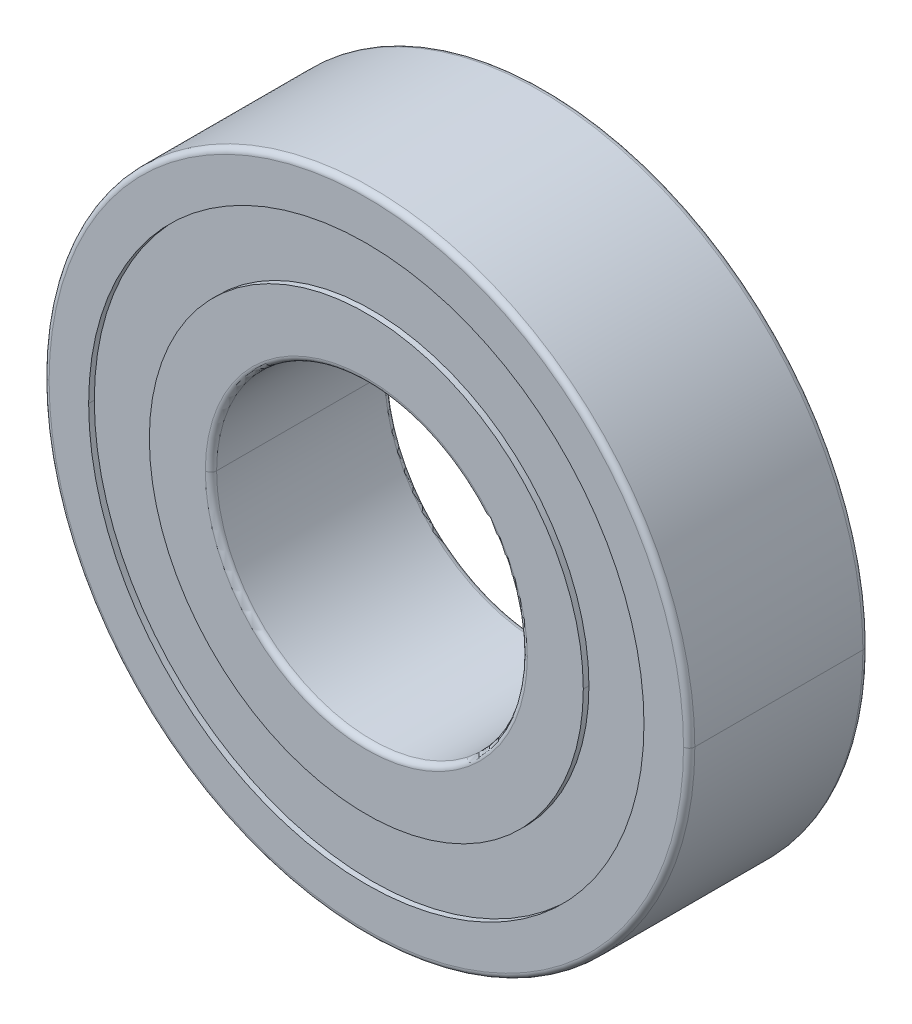
ISO-10303-21;
HEADER;
FILE_DESCRIPTION(('STEP AP214'),'2;1');
FILE_NAME('part.step','',(''),(''),'','','');
FILE_SCHEMA(('AUTOMOTIVE_DESIGN { 1 0 10303 214 1 1 1 1 }'));
ENDSEC;
DATA;
#1=APPLICATION_CONTEXT('core data for automotive mechanical design processes');
#2=APPLICATION_PROTOCOL_DEFINITION('international standard','automotive_design',2000,#1);
#3=PRODUCT_CONTEXT('',#1,'mechanical');
#4=PRODUCT('Part','Part','',(#3));
#5=PRODUCT_RELATED_PRODUCT_CATEGORY('part','',(#4));
#6=PRODUCT_DEFINITION_FORMATION('','',#4);
#7=PRODUCT_DEFINITION_CONTEXT('part definition',#1,'design');
#8=PRODUCT_DEFINITION('design','',#6,#7);
#9=PRODUCT_DEFINITION_SHAPE('','',#8);
#10=(LENGTH_UNIT() NAMED_UNIT(*) SI_UNIT(.MILLI.,.METRE.));
#11=(NAMED_UNIT(*) PLANE_ANGLE_UNIT() SI_UNIT($,.RADIAN.));
#12=(NAMED_UNIT(*) SI_UNIT($,.STERADIAN.) SOLID_ANGLE_UNIT());
#13=UNCERTAINTY_MEASURE_WITH_UNIT(LENGTH_MEASURE(1.E-05),#10,'distance_accuracy_value','');
#14=(GEOMETRIC_REPRESENTATION_CONTEXT(3) GLOBAL_UNCERTAINTY_ASSIGNED_CONTEXT((#13)) GLOBAL_UNIT_ASSIGNED_CONTEXT((#10,
#11,#12)) REPRESENTATION_CONTEXT('',''));
#15=CARTESIAN_POINT('',(0.,0.,0.));
#16=DIRECTION('',(0.,0.,1.));
#17=DIRECTION('',(1.,0.,0.));
#18=AXIS2_PLACEMENT_3D('',#15,#16,#17);
#19=CARTESIAN_POINT('',(0.,0.,-3.71875));
#20=DIRECTION('',(0.,0.,1.));
#21=DIRECTION('',(1.,0.,0.));
#22=AXIS2_PLACEMENT_3D('',#19,#20,#21);
#23=TOROIDAL_SURFACE('',#22,14.0375,0.25);
#24=CARTESIAN_POINT('',(-14.0375,0.,-3.71875));
#25=DIRECTION('',(0.,1.,0.));
#26=DIRECTION('',(-1.,0.,0.));
#27=AXIS2_PLACEMENT_3D('',#24,#25,#26);
#28=CIRCLE('',#27,0.25);
#29=CARTESIAN_POINT('',(-14.0375,0.,-3.96875));
#30=VERTEX_POINT('',#29);
#31=CARTESIAN_POINT('',(-14.2875,0.,-3.71875));
#32=VERTEX_POINT('',#31);
#33=EDGE_CURVE('E305',#30,#32,#28,.T.);
#34=ORIENTED_EDGE('',*,*,#33,.F.);
#35=CARTESIAN_POINT('',(0.,0.,-3.96875));
#36=DIRECTION('',(0.,0.,-1.));
#37=DIRECTION('',(1.,0.,0.));
#38=AXIS2_PLACEMENT_3D('',#35,#36,#37);
#39=CIRCLE('',#38,14.0375);
#40=CARTESIAN_POINT('',(14.0375,0.,-3.96875));
#41=VERTEX_POINT('',#40);
#42=EDGE_CURVE('E355',#41,#30,#39,.T.);
#43=ORIENTED_EDGE('',*,*,#42,.F.);
#44=CARTESIAN_POINT('',(14.0375,0.,-3.71875));
#45=DIRECTION('',(0.,-1.,0.));
#46=DIRECTION('',(0.,0.,-1.));
#47=AXIS2_PLACEMENT_3D('',#44,#45,#46);
#48=CIRCLE('',#47,0.25);
#49=CARTESIAN_POINT('',(14.2875,0.,-3.71875));
#50=VERTEX_POINT('',#49);
#51=EDGE_CURVE('E208',#41,#50,#48,.T.);
#52=ORIENTED_EDGE('',*,*,#51,.T.);
#53=CARTESIAN_POINT('',(0.,0.,-3.71875));
#54=DIRECTION('',(0.,0.,1.));
#55=DIRECTION('',(1.,0.,0.));
#56=AXIS2_PLACEMENT_3D('',#53,#54,#55);
#57=CIRCLE('',#56,14.2875);
#58=EDGE_CURVE('E351',#32,#50,#57,.T.);
#59=ORIENTED_EDGE('',*,*,#58,.F.);
#60=EDGE_LOOP('',(#34,#43,#52,#59));
#61=FACE_BOUND('',#60,.T.);
#62=ADVANCED_FACE('F15',(#61),#23,.T.);
#63=CARTESIAN_POINT('',(0.,0.,3.71875));
#64=DIRECTION('',(0.,0.,-1.));
#65=DIRECTION('',(-1.,0.,0.));
#66=AXIS2_PLACEMENT_3D('',#63,#64,#65);
#67=TOROIDAL_SURFACE('',#66,7.125,0.25);
#68=CARTESIAN_POINT('',(7.125,0.,3.71875));
#69=DIRECTION('',(0.,1.,0.));
#70=DIRECTION('',(-1.,0.,0.));
#71=AXIS2_PLACEMENT_3D('',#68,#69,#70);
#72=CIRCLE('',#71,0.25);
#73=CARTESIAN_POINT('',(6.875,0.,3.71875));
#74=VERTEX_POINT('',#73);
#75=CARTESIAN_POINT('',(7.125,0.,3.96875));
#76=VERTEX_POINT('',#75);
#77=EDGE_CURVE('E186',#74,#76,#72,.T.);
#78=ORIENTED_EDGE('',*,*,#77,.F.);
#79=CARTESIAN_POINT('',(0.,0.,3.71875));
#80=DIRECTION('',(0.,0.,1.));
#81=DIRECTION('',(-1.,0.,0.));
#82=AXIS2_PLACEMENT_3D('',#79,#80,#81);
#83=CIRCLE('',#82,6.875);
#84=CARTESIAN_POINT('',(-6.875,0.,3.71875));
#85=VERTEX_POINT('',#84);
#86=EDGE_CURVE('E179',#85,#74,#83,.T.);
#87=ORIENTED_EDGE('',*,*,#86,.F.);
#88=CARTESIAN_POINT('',(-7.125,0.,3.71875));
#89=DIRECTION('',(0.,-1.,0.));
#90=DIRECTION('',(0.,0.,-1.));
#91=AXIS2_PLACEMENT_3D('',#88,#89,#90);
#92=CIRCLE('',#91,0.25);
#93=CARTESIAN_POINT('',(-7.125,0.,3.96875));
#94=VERTEX_POINT('',#93);
#95=EDGE_CURVE('E183',#85,#94,#92,.T.);
#96=ORIENTED_EDGE('',*,*,#95,.T.);
#97=CARTESIAN_POINT('',(0.,0.,3.96875));
#98=DIRECTION('',(0.,0.,-1.));
#99=DIRECTION('',(-1.,0.,0.));
#100=AXIS2_PLACEMENT_3D('',#97,#98,#99);
#101=CIRCLE('',#100,7.125);
#102=EDGE_CURVE('E10',#76,#94,#101,.T.);
#103=ORIENTED_EDGE('',*,*,#102,.F.);
#104=EDGE_LOOP('',(#78,#87,#96,#103));
#105=FACE_BOUND('',#104,.T.);
#106=ADVANCED_FACE('F181',(#105),#67,.T.);
#107=CARTESIAN_POINT('',(0.,0.,-3.71875));
#108=DIRECTION('',(0.,0.,1.));
#109=DIRECTION('',(1.,0.,0.));
#110=AXIS2_PLACEMENT_3D('',#107,#108,#109);
#111=TOROIDAL_SURFACE('',#110,7.125,0.25);
#112=CARTESIAN_POINT('',(-7.125,0.,-3.71875));
#113=DIRECTION('',(0.,1.,0.));
#114=DIRECTION('',(-1.,0.,0.));
#115=AXIS2_PLACEMENT_3D('',#112,#113,#114);
#116=CIRCLE('',#115,0.25);
#117=CARTESIAN_POINT('',(-6.875,0.,-3.71875));
#118=VERTEX_POINT('',#117);
#119=CARTESIAN_POINT('',(-7.125,0.,-3.96875));
#120=VERTEX_POINT('',#119);
#121=EDGE_CURVE('E246',#118,#120,#116,.T.);
#122=ORIENTED_EDGE('',*,*,#121,.F.);
#123=CARTESIAN_POINT('',(0.,0.,-3.71875));
#124=DIRECTION('',(0.,0.,-1.));
#125=DIRECTION('',(1.,0.,0.));
#126=AXIS2_PLACEMENT_3D('',#123,#124,#125);
#127=CIRCLE('',#126,6.875);
#128=CARTESIAN_POINT('',(6.875,0.,-3.71875));
#129=VERTEX_POINT('',#128);
#130=EDGE_CURVE('E195',#129,#118,#127,.T.);
#131=ORIENTED_EDGE('',*,*,#130,.F.);
#132=CARTESIAN_POINT('',(7.125,0.,-3.71875));
#133=DIRECTION('',(0.,-1.,0.));
#134=DIRECTION('',(0.,0.,-1.));
#135=AXIS2_PLACEMENT_3D('',#132,#133,#134);
#136=CIRCLE('',#135,0.25);
#137=CARTESIAN_POINT('',(7.125,0.,-3.96875));
#138=VERTEX_POINT('',#137);
#139=EDGE_CURVE('E225',#129,#138,#136,.T.);
#140=ORIENTED_EDGE('',*,*,#139,.T.);
#141=CARTESIAN_POINT('',(0.,0.,-3.96875));
#142=DIRECTION('',(0.,0.,1.));
#143=DIRECTION('',(1.,0.,0.));
#144=AXIS2_PLACEMENT_3D('',#141,#142,#143);
#145=CIRCLE('',#144,7.125);
#146=EDGE_CURVE('E262',#120,#138,#145,.T.);
#147=ORIENTED_EDGE('',*,*,#146,.F.);
#148=EDGE_LOOP('',(#122,#131,#140,#147));
#149=FACE_BOUND('',#148,.T.);
#150=ADVANCED_FACE('F418',(#149),#111,.T.);
#151=CARTESIAN_POINT('',(0.,0.,3.71875));
#152=DIRECTION('',(0.,0.,-1.));
#153=DIRECTION('',(-1.,0.,0.));
#154=AXIS2_PLACEMENT_3D('',#151,#152,#153);
#155=TOROIDAL_SURFACE('',#154,14.0375,0.25);
#156=CARTESIAN_POINT('',(14.0375,0.,3.71875));
#157=DIRECTION('',(0.,1.,0.));
#158=DIRECTION('',(-1.,0.,0.));
#159=AXIS2_PLACEMENT_3D('',#156,#157,#158);
#160=CIRCLE('',#159,0.25);
#161=CARTESIAN_POINT('',(14.0375,0.,3.96875));
#162=VERTEX_POINT('',#161);
#163=CARTESIAN_POINT('',(14.2875,0.,3.71875));
#164=VERTEX_POINT('',#163);
#165=EDGE_CURVE('E224',#162,#164,#160,.T.);
#166=ORIENTED_EDGE('',*,*,#165,.F.);
#167=CARTESIAN_POINT('',(0.,0.,3.96875));
#168=DIRECTION('',(0.,0.,1.));
#169=DIRECTION('',(-1.,0.,0.));
#170=AXIS2_PLACEMENT_3D('',#167,#168,#169);
#171=CIRCLE('',#170,14.0375);
#172=CARTESIAN_POINT('',(-14.0375,0.,3.96875));
#173=VERTEX_POINT('',#172);
#174=EDGE_CURVE('E263',#173,#162,#171,.T.);
#175=ORIENTED_EDGE('',*,*,#174,.F.);
#176=CARTESIAN_POINT('',(-14.0375,0.,3.71875));
#177=DIRECTION('',(0.,-1.,0.));
#178=DIRECTION('',(0.,0.,-1.));
#179=AXIS2_PLACEMENT_3D('',#176,#177,#178);
#180=CIRCLE('',#179,0.25);
#181=CARTESIAN_POINT('',(-14.2875,0.,3.71875));
#182=VERTEX_POINT('',#181);
#183=EDGE_CURVE('E228',#173,#182,#180,.T.);
#184=ORIENTED_EDGE('',*,*,#183,.T.);
#185=CARTESIAN_POINT('',(0.,0.,3.71875));
#186=DIRECTION('',(0.,0.,-1.));
#187=DIRECTION('',(-1.,0.,0.));
#188=AXIS2_PLACEMENT_3D('',#185,#186,#187);
#189=CIRCLE('',#188,14.2875);
#190=EDGE_CURVE('E268',#164,#182,#189,.T.);
#191=ORIENTED_EDGE('',*,*,#190,.F.);
#192=EDGE_LOOP('',(#166,#175,#184,#191));
#193=FACE_BOUND('',#192,.T.);
#194=ADVANCED_FACE('F393',(#193),#155,.T.);
#195=CARTESIAN_POINT('',(0.,0.,53.2489151398072));
#196=DIRECTION('',(0.,0.,1.));
#197=DIRECTION('',(1.,0.,0.));
#198=AXIS2_PLACEMENT_3D('',#195,#196,#197);
#199=CYLINDRICAL_SURFACE('',#198,6.875);
#200=DIRECTION('',(0.,0.,1.));
#201=VECTOR('',#200,1.);
#202=CARTESIAN_POINT('',(-6.875,0.,53.2489151398072));
#203=LINE('',#202,#201);
#204=EDGE_CURVE('E190',#118,#85,#203,.T.);
#205=ORIENTED_EDGE('',*,*,#204,.F.);
#206=CARTESIAN_POINT('',(0.,0.,-3.71875));
#207=DIRECTION('',(0.,0.,-1.));
#208=DIRECTION('',(1.,0.,0.));
#209=AXIS2_PLACEMENT_3D('',#206,#207,#208);
#210=CIRCLE('',#209,6.875);
#211=EDGE_CURVE('E205',#118,#129,#210,.T.);
#212=ORIENTED_EDGE('',*,*,#211,.T.);
#213=DIRECTION('',(0.,0.,1.));
#214=VECTOR('',#213,1.);
#215=CARTESIAN_POINT('',(6.875,0.,53.2489151398072));
#216=LINE('',#215,#214);
#217=EDGE_CURVE('E19',#129,#74,#216,.T.);
#218=ORIENTED_EDGE('',*,*,#217,.T.);
#219=CARTESIAN_POINT('',(0.,0.,3.71875));
#220=DIRECTION('',(0.,0.,1.));
#221=DIRECTION('',(-1.,0.,0.));
#222=AXIS2_PLACEMENT_3D('',#219,#220,#221);
#223=CIRCLE('',#222,6.875);
#224=EDGE_CURVE('E201',#74,#85,#223,.T.);
#225=ORIENTED_EDGE('',*,*,#224,.T.);
#226=EDGE_LOOP('',(#205,#212,#218,#225));
#227=FACE_BOUND('',#226,.T.);
#228=ADVANCED_FACE('F17',(#227),#199,.F.);
#229=CARTESIAN_POINT('',(0.,9.602,3.96875));
#230=DIRECTION('',(0.,0.,-1.));
#231=DIRECTION('',(0.,-1.,0.));
#232=AXIS2_PLACEMENT_3D('',#229,#230,#231);
#233=PLANE('',#232);
#234=CARTESIAN_POINT('',(0.,0.,3.96875));
#235=DIRECTION('',(0.,0.,-1.));
#236=DIRECTION('',(-1.,0.,0.));
#237=AXIS2_PLACEMENT_3D('',#234,#235,#236);
#238=CIRCLE('',#237,7.125);
#239=EDGE_CURVE('E203',#94,#76,#238,.T.);
#240=ORIENTED_EDGE('',*,*,#239,.T.);
#241=ORIENTED_EDGE('',*,*,#102,.T.);
#242=EDGE_LOOP('',(#240,#241));
#243=FACE_BOUND('',#242,.T.);
#244=CARTESIAN_POINT('',(0.,0.,3.96875));
#245=DIRECTION('',(0.,0.,1.));
#246=DIRECTION('',(1.,0.,0.));
#247=AXIS2_PLACEMENT_3D('',#244,#245,#246);
#248=CIRCLE('',#247,9.602);
#249=CARTESIAN_POINT('',(9.602,0.,3.96875));
#250=VERTEX_POINT('',#249);
#251=CARTESIAN_POINT('',(-9.602,0.,3.96875));
#252=VERTEX_POINT('',#251);
#253=EDGE_CURVE('E269',#250,#252,#248,.T.);
#254=ORIENTED_EDGE('',*,*,#253,.T.);
#255=CARTESIAN_POINT('',(0.,0.,3.96875));
#256=DIRECTION('',(0.,0.,1.));
#257=DIRECTION('',(1.,0.,0.));
#258=AXIS2_PLACEMENT_3D('',#255,#256,#257);
#259=CIRCLE('',#258,9.602);
#260=EDGE_CURVE('E26',#252,#250,#259,.T.);
#261=ORIENTED_EDGE('',*,*,#260,.T.);
#262=EDGE_LOOP('',(#254,#261));
#263=FACE_BOUND('',#262,.T.);
#264=ADVANCED_FACE('F421',(#243,#263),#233,.F.);
#265=CARTESIAN_POINT('',(0.,0.,53.2489151398072));
#266=DIRECTION('',(0.,0.,1.));
#267=DIRECTION('',(1.,0.,0.));
#268=AXIS2_PLACEMENT_3D('',#265,#266,#267);
#269=CYLINDRICAL_SURFACE('',#268,9.602);
#270=DIRECTION('',(0.,0.,1.));
#271=VECTOR('',#270,1.);
#272=CARTESIAN_POINT('',(-9.602,0.,53.2489151398072));
#273=LINE('',#272,#271);
#274=CARTESIAN_POINT('',(-9.602,0.,3.71875));
#275=VERTEX_POINT('',#274);
#276=EDGE_CURVE('E274',#275,#252,#273,.T.);
#277=ORIENTED_EDGE('',*,*,#276,.F.);
#278=CARTESIAN_POINT('',(0.,0.,3.71875));
#279=DIRECTION('',(0.,0.,1.));
#280=DIRECTION('',(1.,0.,0.));
#281=AXIS2_PLACEMENT_3D('',#278,#279,#280);
#282=CIRCLE('',#281,9.602);
#283=CARTESIAN_POINT('',(9.602,0.,3.71875));
#284=VERTEX_POINT('',#283);
#285=EDGE_CURVE('E297',#275,#284,#282,.T.);
#286=ORIENTED_EDGE('',*,*,#285,.T.);
#287=DIRECTION('',(0.,0.,1.));
#288=VECTOR('',#287,1.);
#289=CARTESIAN_POINT('',(9.602,0.,53.2489151398072));
#290=LINE('',#289,#288);
#291=EDGE_CURVE('E273',#284,#250,#290,.T.);
#292=ORIENTED_EDGE('',*,*,#291,.T.);
#293=ORIENTED_EDGE('',*,*,#260,.F.);
#294=EDGE_LOOP('',(#277,#286,#292,#293));
#295=FACE_BOUND('',#294,.T.);
#296=ADVANCED_FACE('F424',(#295),#269,.T.);
#297=CARTESIAN_POINT('',(0.,12.2875,3.71875));
#298=DIRECTION('',(0.,0.,-1.));
#299=DIRECTION('',(0.,-1.,0.));
#300=AXIS2_PLACEMENT_3D('',#297,#298,#299);
#301=PLANE('',#300);
#302=CARTESIAN_POINT('',(0.,0.,3.71875));
#303=DIRECTION('',(0.,0.,1.));
#304=DIRECTION('',(1.,0.,0.));
#305=AXIS2_PLACEMENT_3D('',#302,#303,#304);
#306=CIRCLE('',#305,9.602);
#307=EDGE_CURVE('E301',#284,#275,#306,.T.);
#308=ORIENTED_EDGE('',*,*,#307,.F.);
#309=ORIENTED_EDGE('',*,*,#285,.F.);
#310=EDGE_LOOP('',(#308,#309));
#311=FACE_BOUND('',#310,.T.);
#312=CARTESIAN_POINT('',(0.,0.,3.71875));
#313=DIRECTION('',(0.,0.,1.));
#314=DIRECTION('',(1.,0.,0.));
#315=AXIS2_PLACEMENT_3D('',#312,#313,#314);
#316=CIRCLE('',#315,12.2875);
#317=CARTESIAN_POINT('',(12.2875,0.,3.71875));
#318=VERTEX_POINT('',#317);
#319=CARTESIAN_POINT('',(-12.2875,0.,3.71875));
#320=VERTEX_POINT('',#319);
#321=EDGE_CURVE('E293',#318,#320,#316,.T.);
#322=ORIENTED_EDGE('',*,*,#321,.T.);
#323=CARTESIAN_POINT('',(0.,0.,3.71875));
#324=DIRECTION('',(0.,0.,1.));
#325=DIRECTION('',(1.,0.,0.));
#326=AXIS2_PLACEMENT_3D('',#323,#324,#325);
#327=CIRCLE('',#326,12.2875);
#328=EDGE_CURVE('E339',#320,#318,#327,.T.);
#329=ORIENTED_EDGE('',*,*,#328,.T.);
#330=EDGE_LOOP('',(#322,#329));
#331=FACE_BOUND('',#330,.T.);
#332=ADVANCED_FACE('F409',(#311,#331),#301,.F.);
#333=CARTESIAN_POINT('',(0.,0.,53.2489151398072));
#334=DIRECTION('',(0.,0.,1.));
#335=DIRECTION('',(1.,0.,0.));
#336=AXIS2_PLACEMENT_3D('',#333,#334,#335);
#337=CYLINDRICAL_SURFACE('',#336,12.2875);
#338=DIRECTION('',(0.,0.,1.));
#339=VECTOR('',#338,1.);
#340=CARTESIAN_POINT('',(-12.2875,0.,53.2489151398072));
#341=LINE('',#340,#339);
#342=CARTESIAN_POINT('',(-12.2875,0.,3.96875));
#343=VERTEX_POINT('',#342);
#344=EDGE_CURVE('E252',#320,#343,#341,.T.);
#345=ORIENTED_EDGE('',*,*,#344,.F.);
#346=ORIENTED_EDGE('',*,*,#321,.F.);
#347=DIRECTION('',(0.,0.,1.));
#348=VECTOR('',#347,1.);
#349=CARTESIAN_POINT('',(12.2875,0.,53.2489151398072));
#350=LINE('',#349,#348);
#351=CARTESIAN_POINT('',(12.2875,0.,3.96875));
#352=VERTEX_POINT('',#351);
#353=EDGE_CURVE('E251',#318,#352,#350,.T.);
#354=ORIENTED_EDGE('',*,*,#353,.T.);
#355=CARTESIAN_POINT('',(0.,0.,3.96875));
#356=DIRECTION('',(0.,0.,1.));
#357=DIRECTION('',(1.,0.,0.));
#358=AXIS2_PLACEMENT_3D('',#355,#356,#357);
#359=CIRCLE('',#358,12.2875);
#360=EDGE_CURVE('E267',#352,#343,#359,.T.);
#361=ORIENTED_EDGE('',*,*,#360,.T.);
#362=EDGE_LOOP('',(#345,#346,#354,#361));
#363=FACE_BOUND('',#362,.T.);
#364=ADVANCED_FACE('F400',(#363),#337,.F.);
#365=CARTESIAN_POINT('',(0.,14.2875,3.96875));
#366=DIRECTION('',(0.,0.,-1.));
#367=DIRECTION('',(0.,-1.,0.));
#368=AXIS2_PLACEMENT_3D('',#365,#366,#367);
#369=PLANE('',#368);
#370=ORIENTED_EDGE('',*,*,#360,.F.);
#371=CARTESIAN_POINT('',(0.,0.,3.96875));
#372=DIRECTION('',(0.,0.,1.));
#373=DIRECTION('',(1.,0.,0.));
#374=AXIS2_PLACEMENT_3D('',#371,#372,#373);
#375=CIRCLE('',#374,12.2875);
#376=EDGE_CURVE('E247',#343,#352,#375,.T.);
#377=ORIENTED_EDGE('',*,*,#376,.F.);
#378=EDGE_LOOP('',(#370,#377));
#379=FACE_BOUND('',#378,.T.);
#380=ORIENTED_EDGE('',*,*,#174,.T.);
#381=CARTESIAN_POINT('',(0.,0.,3.96875));
#382=DIRECTION('',(0.,0.,1.));
#383=DIRECTION('',(-1.,0.,0.));
#384=AXIS2_PLACEMENT_3D('',#381,#382,#383);
#385=CIRCLE('',#384,14.0375);
#386=EDGE_CURVE('E221',#162,#173,#385,.T.);
#387=ORIENTED_EDGE('',*,*,#386,.T.);
#388=EDGE_LOOP('',(#380,#387));
#389=FACE_BOUND('',#388,.T.);
#390=ADVANCED_FACE('F398',(#379,#389),#369,.F.);
#391=CARTESIAN_POINT('',(0.,0.,53.2489151398072));
#392=DIRECTION('',(0.,0.,1.));
#393=DIRECTION('',(1.,0.,0.));
#394=AXIS2_PLACEMENT_3D('',#391,#392,#393);
#395=CYLINDRICAL_SURFACE('',#394,14.2875);
#396=DIRECTION('',(0.,0.,1.));
#397=VECTOR('',#396,1.);
#398=CARTESIAN_POINT('',(-14.2875,0.,53.2489151398072));
#399=LINE('',#398,#397);
#400=EDGE_CURVE('E238',#32,#182,#399,.T.);
#401=ORIENTED_EDGE('',*,*,#400,.F.);
#402=ORIENTED_EDGE('',*,*,#58,.T.);
#403=DIRECTION('',(0.,0.,1.));
#404=VECTOR('',#403,1.);
#405=CARTESIAN_POINT('',(14.2875,0.,53.2489151398072));
#406=LINE('',#405,#404);
#407=EDGE_CURVE('E233',#50,#164,#406,.T.);
#408=ORIENTED_EDGE('',*,*,#407,.T.);
#409=ORIENTED_EDGE('',*,*,#190,.T.);
#410=EDGE_LOOP('',(#401,#402,#408,#409));
#411=FACE_BOUND('',#410,.T.);
#412=ADVANCED_FACE('F383',(#411),#395,.T.);
#413=CARTESIAN_POINT('',(0.,12.2875,-3.96875));
#414=DIRECTION('',(0.,0.,1.));
#415=DIRECTION('',(1.,0.,0.));
#416=AXIS2_PLACEMENT_3D('',#413,#414,#415);
#417=PLANE('',#416);
#418=CARTESIAN_POINT('',(0.,0.,-3.96875));
#419=DIRECTION('',(0.,0.,1.));
#420=DIRECTION('',(1.,0.,0.));
#421=AXIS2_PLACEMENT_3D('',#418,#419,#420);
#422=CIRCLE('',#421,12.2875);
#423=CARTESIAN_POINT('',(12.2875,0.,-3.96875));
#424=VERTEX_POINT('',#423);
#425=CARTESIAN_POINT('',(-12.2875,0.,-3.96875));
#426=VERTEX_POINT('',#425);
#427=EDGE_CURVE('E91',#424,#426,#422,.T.);
#428=ORIENTED_EDGE('',*,*,#427,.T.);
#429=CARTESIAN_POINT('',(0.,0.,-3.96875));
#430=DIRECTION('',(0.,0.,1.));
#431=DIRECTION('',(1.,0.,0.));
#432=AXIS2_PLACEMENT_3D('',#429,#430,#431);
#433=CIRCLE('',#432,12.2875);
#434=EDGE_CURVE('E237',#426,#424,#433,.T.);
#435=ORIENTED_EDGE('',*,*,#434,.T.);
#436=EDGE_LOOP('',(#428,#435));
#437=FACE_BOUND('',#436,.T.);
#438=ORIENTED_EDGE('',*,*,#42,.T.);
#439=CARTESIAN_POINT('',(0.,0.,-3.96875));
#440=DIRECTION('',(0.,0.,-1.));
#441=DIRECTION('',(1.,0.,0.));
#442=AXIS2_PLACEMENT_3D('',#439,#440,#441);
#443=CIRCLE('',#442,14.0375);
#444=EDGE_CURVE('E308',#30,#41,#443,.T.);
#445=ORIENTED_EDGE('',*,*,#444,.T.);
#446=EDGE_LOOP('',(#438,#445));
#447=FACE_BOUND('',#446,.T.);
#448=ADVANCED_FACE('F372',(#437,#447),#417,.F.);
#449=CARTESIAN_POINT('',(0.,0.,53.2489151398072));
#450=DIRECTION('',(0.,0.,1.));
#451=DIRECTION('',(1.,0.,0.));
#452=AXIS2_PLACEMENT_3D('',#449,#450,#451);
#453=CYLINDRICAL_SURFACE('',#452,12.2875);
#454=DIRECTION('',(0.,0.,1.));
#455=VECTOR('',#454,1.);
#456=CARTESIAN_POINT('',(-12.2875,0.,53.2489151398072));
#457=LINE('',#456,#455);
#458=CARTESIAN_POINT('',(-12.2875,0.,-3.71875));
#459=VERTEX_POINT('',#458);
#460=EDGE_CURVE('E320',#426,#459,#457,.T.);
#461=ORIENTED_EDGE('',*,*,#460,.F.);
#462=ORIENTED_EDGE('',*,*,#427,.F.);
#463=DIRECTION('',(0.,0.,1.));
#464=VECTOR('',#463,1.);
#465=CARTESIAN_POINT('',(12.2875,0.,53.2489151398072));
#466=LINE('',#465,#464);
#467=CARTESIAN_POINT('',(12.2875,0.,-3.71875));
#468=VERTEX_POINT('',#467);
#469=EDGE_CURVE('E279',#424,#468,#466,.T.);
#470=ORIENTED_EDGE('',*,*,#469,.T.);
#471=CARTESIAN_POINT('',(0.,0.,-3.71875));
#472=DIRECTION('',(0.,0.,1.));
#473=DIRECTION('',(1.,0.,0.));
#474=AXIS2_PLACEMENT_3D('',#471,#472,#473);
#475=CIRCLE('',#474,12.2875);
#476=EDGE_CURVE('E77',#468,#459,#475,.T.);
#477=ORIENTED_EDGE('',*,*,#476,.T.);
#478=EDGE_LOOP('',(#461,#462,#470,#477));
#479=FACE_BOUND('',#478,.T.);
#480=ADVANCED_FACE('F469',(#479),#453,.F.);
#481=CARTESIAN_POINT('',(0.,9.602,-3.71875));
#482=DIRECTION('',(0.,0.,1.));
#483=DIRECTION('',(1.,0.,0.));
#484=AXIS2_PLACEMENT_3D('',#481,#482,#483);
#485=PLANE('',#484);
#486=CARTESIAN_POINT('',(0.,0.,-3.71875));
#487=DIRECTION('',(0.,0.,1.));
#488=DIRECTION('',(1.,0.,0.));
#489=AXIS2_PLACEMENT_3D('',#486,#487,#488);
#490=CIRCLE('',#489,9.602);
#491=CARTESIAN_POINT('',(9.602,0.,-3.71875));
#492=VERTEX_POINT('',#491);
#493=CARTESIAN_POINT('',(-9.602,0.,-3.71875));
#494=VERTEX_POINT('',#493);
#495=EDGE_CURVE('E239',#492,#494,#490,.T.);
#496=ORIENTED_EDGE('',*,*,#495,.T.);
#497=CARTESIAN_POINT('',(0.,0.,-3.71875));
#498=DIRECTION('',(0.,0.,1.));
#499=DIRECTION('',(1.,0.,0.));
#500=AXIS2_PLACEMENT_3D('',#497,#498,#499);
#501=CIRCLE('',#500,9.602);
#502=EDGE_CURVE('E40',#494,#492,#501,.T.);
#503=ORIENTED_EDGE('',*,*,#502,.T.);
#504=EDGE_LOOP('',(#496,#503));
#505=FACE_BOUND('',#504,.T.);
#506=ORIENTED_EDGE('',*,*,#476,.F.);
#507=CARTESIAN_POINT('',(0.,0.,-3.71875));
#508=DIRECTION('',(0.,0.,1.));
#509=DIRECTION('',(1.,0.,0.));
#510=AXIS2_PLACEMENT_3D('',#507,#508,#509);
#511=CIRCLE('',#510,12.2875);
#512=EDGE_CURVE('E282',#459,#468,#511,.T.);
#513=ORIENTED_EDGE('',*,*,#512,.F.);
#514=EDGE_LOOP('',(#506,#513));
#515=FACE_BOUND('',#514,.T.);
#516=ADVANCED_FACE('F473',(#505,#515),#485,.F.);
#517=CARTESIAN_POINT('',(0.,0.,53.2489151398072));
#518=DIRECTION('',(0.,0.,1.));
#519=DIRECTION('',(1.,0.,0.));
#520=AXIS2_PLACEMENT_3D('',#517,#518,#519);
#521=CYLINDRICAL_SURFACE('',#520,9.602);
#522=DIRECTION('',(0.,0.,1.));
#523=VECTOR('',#522,1.);
#524=CARTESIAN_POINT('',(-9.602,0.,53.2489151398072));
#525=LINE('',#524,#523);
#526=CARTESIAN_POINT('',(-9.602,0.,-3.96875));
#527=VERTEX_POINT('',#526);
#528=EDGE_CURVE('E243',#527,#494,#525,.T.);
#529=ORIENTED_EDGE('',*,*,#528,.F.);
#530=CARTESIAN_POINT('',(0.,0.,-3.96875));
#531=DIRECTION('',(0.,0.,1.));
#532=DIRECTION('',(1.,0.,0.));
#533=AXIS2_PLACEMENT_3D('',#530,#531,#532);
#534=CIRCLE('',#533,9.602);
#535=CARTESIAN_POINT('',(9.602,0.,-3.96875));
#536=VERTEX_POINT('',#535);
#537=EDGE_CURVE('E287',#527,#536,#534,.T.);
#538=ORIENTED_EDGE('',*,*,#537,.T.);
#539=DIRECTION('',(0.,0.,1.));
#540=VECTOR('',#539,1.);
#541=CARTESIAN_POINT('',(9.602,0.,53.2489151398072));
#542=LINE('',#541,#540);
#543=EDGE_CURVE('E242',#536,#492,#542,.T.);
#544=ORIENTED_EDGE('',*,*,#543,.T.);
#545=ORIENTED_EDGE('',*,*,#502,.F.);
#546=EDGE_LOOP('',(#529,#538,#544,#545));
#547=FACE_BOUND('',#546,.T.);
#548=ADVANCED_FACE('F455',(#547),#521,.T.);
#549=CARTESIAN_POINT('',(0.,6.875,-3.96875));
#550=DIRECTION('',(0.,0.,1.));
#551=DIRECTION('',(1.,0.,0.));
#552=AXIS2_PLACEMENT_3D('',#549,#550,#551);
#553=PLANE('',#552);
#554=CARTESIAN_POINT('',(0.,0.,-3.96875));
#555=DIRECTION('',(0.,0.,1.));
#556=DIRECTION('',(1.,0.,0.));
#557=AXIS2_PLACEMENT_3D('',#554,#555,#556);
#558=CIRCLE('',#557,7.125);
#559=EDGE_CURVE('E253',#138,#120,#558,.T.);
#560=ORIENTED_EDGE('',*,*,#559,.T.);
#561=ORIENTED_EDGE('',*,*,#146,.T.);
#562=EDGE_LOOP('',(#560,#561));
#563=FACE_BOUND('',#562,.T.);
#564=CARTESIAN_POINT('',(0.,0.,-3.96875));
#565=DIRECTION('',(0.,0.,1.));
#566=DIRECTION('',(1.,0.,0.));
#567=AXIS2_PLACEMENT_3D('',#564,#565,#566);
#568=CIRCLE('',#567,9.602);
#569=EDGE_CURVE('E278',#536,#527,#568,.T.);
#570=ORIENTED_EDGE('',*,*,#569,.F.);
#571=ORIENTED_EDGE('',*,*,#537,.F.);
#572=EDGE_LOOP('',(#570,#571));
#573=FACE_BOUND('',#572,.T.);
#574=ADVANCED_FACE('F453',(#563,#573),#553,.F.);
#575=CARTESIAN_POINT('',(0.,0.,53.2489151398072));
#576=DIRECTION('',(0.,0.,1.));
#577=DIRECTION('',(1.,0.,0.));
#578=AXIS2_PLACEMENT_3D('',#575,#576,#577);
#579=CYLINDRICAL_SURFACE('',#578,9.602);
#580=ORIENTED_EDGE('',*,*,#569,.T.);
#581=ORIENTED_EDGE('',*,*,#528,.T.);
#582=ORIENTED_EDGE('',*,*,#495,.F.);
#583=ORIENTED_EDGE('',*,*,#543,.F.);
#584=EDGE_LOOP('',(#580,#581,#582,#583));
#585=FACE_BOUND('',#584,.T.);
#586=ADVANCED_FACE('F445',(#585),#579,.T.);
#587=CARTESIAN_POINT('',(0.,0.,53.2489151398072));
#588=DIRECTION('',(0.,0.,1.));
#589=DIRECTION('',(1.,0.,0.));
#590=AXIS2_PLACEMENT_3D('',#587,#588,#589);
#591=CYLINDRICAL_SURFACE('',#590,12.2875);
#592=ORIENTED_EDGE('',*,*,#434,.F.);
#593=ORIENTED_EDGE('',*,*,#460,.T.);
#594=ORIENTED_EDGE('',*,*,#512,.T.);
#595=ORIENTED_EDGE('',*,*,#469,.F.);
#596=EDGE_LOOP('',(#592,#593,#594,#595));
#597=FACE_BOUND('',#596,.T.);
#598=ADVANCED_FACE('F442',(#597),#591,.F.);
#599=CARTESIAN_POINT('',(0.,0.,53.2489151398072));
#600=DIRECTION('',(0.,0.,1.));
#601=DIRECTION('',(1.,0.,0.));
#602=AXIS2_PLACEMENT_3D('',#599,#600,#601);
#603=CYLINDRICAL_SURFACE('',#602,14.2875);
#604=CARTESIAN_POINT('',(0.,0.,-3.71875));
#605=DIRECTION('',(0.,0.,1.));
#606=DIRECTION('',(1.,0.,0.));
#607=AXIS2_PLACEMENT_3D('',#604,#605,#606);
#608=CIRCLE('',#607,14.2875);
#609=EDGE_CURVE('E217',#50,#32,#608,.T.);
#610=ORIENTED_EDGE('',*,*,#609,.T.);
#611=ORIENTED_EDGE('',*,*,#400,.T.);
#612=CARTESIAN_POINT('',(0.,0.,3.71875));
#613=DIRECTION('',(0.,0.,-1.));
#614=DIRECTION('',(-1.,0.,0.));
#615=AXIS2_PLACEMENT_3D('',#612,#613,#614);
#616=CIRCLE('',#615,14.2875);
#617=EDGE_CURVE('E232',#182,#164,#616,.T.);
#618=ORIENTED_EDGE('',*,*,#617,.T.);
#619=ORIENTED_EDGE('',*,*,#407,.F.);
#620=EDGE_LOOP('',(#610,#611,#618,#619));
#621=FACE_BOUND('',#620,.T.);
#622=ADVANCED_FACE('F385',(#621),#603,.T.);
#623=CARTESIAN_POINT('',(0.,0.,53.2489151398072));
#624=DIRECTION('',(0.,0.,1.));
#625=DIRECTION('',(1.,0.,0.));
#626=AXIS2_PLACEMENT_3D('',#623,#624,#625);
#627=CYLINDRICAL_SURFACE('',#626,12.2875);
#628=ORIENTED_EDGE('',*,*,#328,.F.);
#629=ORIENTED_EDGE('',*,*,#344,.T.);
#630=ORIENTED_EDGE('',*,*,#376,.T.);
#631=ORIENTED_EDGE('',*,*,#353,.F.);
#632=EDGE_LOOP('',(#628,#629,#630,#631));
#633=FACE_BOUND('',#632,.T.);
#634=ADVANCED_FACE('F438',(#633),#627,.F.);
#635=CARTESIAN_POINT('',(0.,0.,53.2489151398072));
#636=DIRECTION('',(0.,0.,1.));
#637=DIRECTION('',(1.,0.,0.));
#638=AXIS2_PLACEMENT_3D('',#635,#636,#637);
#639=CYLINDRICAL_SURFACE('',#638,9.602);
#640=ORIENTED_EDGE('',*,*,#307,.T.);
#641=ORIENTED_EDGE('',*,*,#276,.T.);
#642=ORIENTED_EDGE('',*,*,#253,.F.);
#643=ORIENTED_EDGE('',*,*,#291,.F.);
#644=EDGE_LOOP('',(#640,#641,#642,#643));
#645=FACE_BOUND('',#644,.T.);
#646=ADVANCED_FACE('F433',(#645),#639,.T.);
#647=CARTESIAN_POINT('',(0.,0.,53.2489151398072));
#648=DIRECTION('',(0.,0.,1.));
#649=DIRECTION('',(1.,0.,0.));
#650=AXIS2_PLACEMENT_3D('',#647,#648,#649);
#651=CYLINDRICAL_SURFACE('',#650,6.875);
#652=ORIENTED_EDGE('',*,*,#130,.T.);
#653=ORIENTED_EDGE('',*,*,#204,.T.);
#654=ORIENTED_EDGE('',*,*,#86,.T.);
#655=ORIENTED_EDGE('',*,*,#217,.F.);
#656=EDGE_LOOP('',(#652,#653,#654,#655));
#657=FACE_BOUND('',#656,.T.);
#658=ADVANCED_FACE('F193',(#657),#651,.F.);
#659=CARTESIAN_POINT('',(0.,0.,3.71875));
#660=DIRECTION('',(0.,0.,-1.));
#661=DIRECTION('',(-1.,0.,0.));
#662=AXIS2_PLACEMENT_3D('',#659,#660,#661);
#663=TOROIDAL_SURFACE('',#662,14.0375,0.25);
#664=ORIENTED_EDGE('',*,*,#386,.F.);
#665=ORIENTED_EDGE('',*,*,#165,.T.);
#666=ORIENTED_EDGE('',*,*,#617,.F.);
#667=ORIENTED_EDGE('',*,*,#183,.F.);
#668=EDGE_LOOP('',(#664,#665,#666,#667));
#669=FACE_BOUND('',#668,.T.);
#670=ADVANCED_FACE('F391',(#669),#663,.T.);
#671=CARTESIAN_POINT('',(0.,0.,-3.71875));
#672=DIRECTION('',(0.,0.,1.));
#673=DIRECTION('',(1.,0.,0.));
#674=AXIS2_PLACEMENT_3D('',#671,#672,#673);
#675=TOROIDAL_SURFACE('',#674,7.125,0.25);
#676=ORIENTED_EDGE('',*,*,#211,.F.);
#677=ORIENTED_EDGE('',*,*,#121,.T.);
#678=ORIENTED_EDGE('',*,*,#559,.F.);
#679=ORIENTED_EDGE('',*,*,#139,.F.);
#680=EDGE_LOOP('',(#676,#677,#678,#679));
#681=FACE_BOUND('',#680,.T.);
#682=ADVANCED_FACE('F427',(#681),#675,.T.);
#683=CARTESIAN_POINT('',(0.,0.,3.71875));
#684=DIRECTION('',(0.,0.,-1.));
#685=DIRECTION('',(-1.,0.,0.));
#686=AXIS2_PLACEMENT_3D('',#683,#684,#685);
#687=TOROIDAL_SURFACE('',#686,7.125,0.25);
#688=ORIENTED_EDGE('',*,*,#224,.F.);
#689=ORIENTED_EDGE('',*,*,#77,.T.);
#690=ORIENTED_EDGE('',*,*,#239,.F.);
#691=ORIENTED_EDGE('',*,*,#95,.F.);
#692=EDGE_LOOP('',(#688,#689,#690,#691));
#693=FACE_BOUND('',#692,.T.);
#694=ADVANCED_FACE('F200',(#693),#687,.T.);
#695=CARTESIAN_POINT('',(0.,0.,-3.71875));
#696=DIRECTION('',(0.,0.,1.));
#697=DIRECTION('',(1.,0.,0.));
#698=AXIS2_PLACEMENT_3D('',#695,#696,#697);
#699=TOROIDAL_SURFACE('',#698,14.0375,0.25);
#700=ORIENTED_EDGE('',*,*,#444,.F.);
#701=ORIENTED_EDGE('',*,*,#33,.T.);
#702=ORIENTED_EDGE('',*,*,#609,.F.);
#703=ORIENTED_EDGE('',*,*,#51,.F.);
#704=EDGE_LOOP('',(#700,#701,#702,#703));
#705=FACE_BOUND('',#704,.T.);
#706=ADVANCED_FACE('F376',(#705),#699,.T.);
#707=CLOSED_SHELL('',(#62,#106,#150,#194,#228,#264,#296,#332,#364,#390,#412,#448,#480,#516,#548,
#574,#586,#598,#622,#634,#646,#658,#670,#682,#694,#706));
#708=MANIFOLD_SOLID_BREP('B1',#707);
#709=ADVANCED_BREP_SHAPE_REPRESENTATION('',(#18,#708),#14);
#710=SHAPE_DEFINITION_REPRESENTATION(#9,#709);
ENDSEC;
END-ISO-10303-21;
